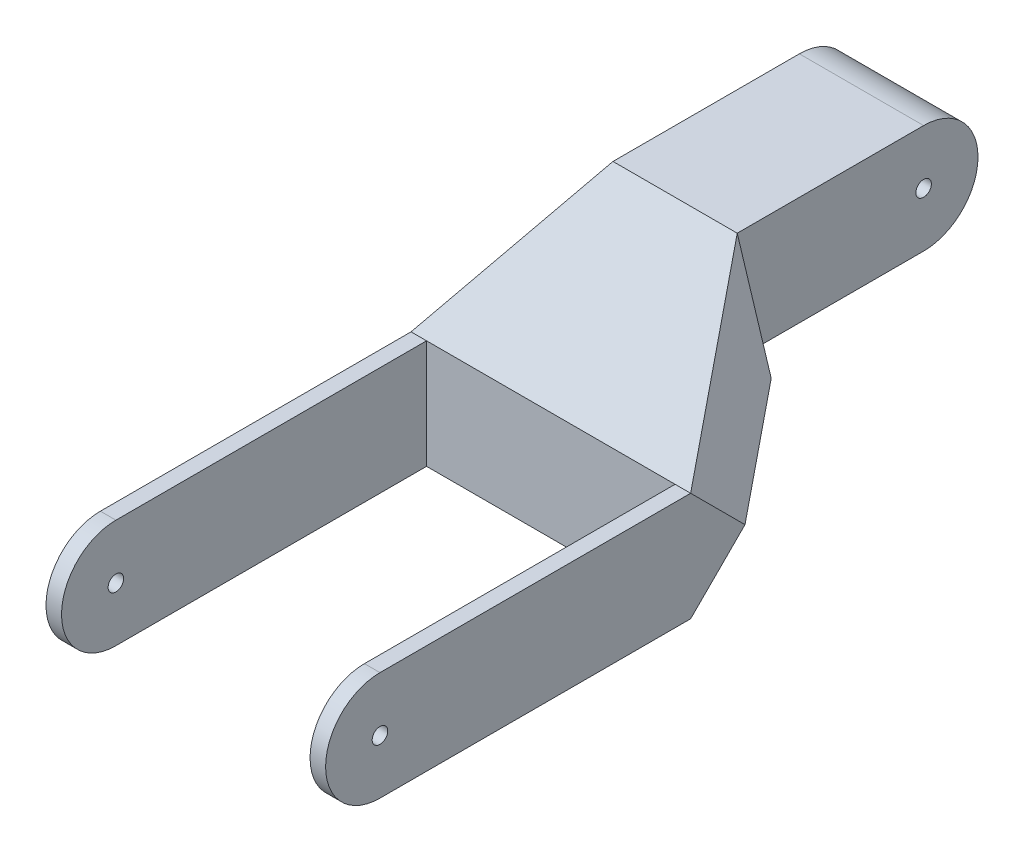
ISO-10303-21;
HEADER;
FILE_DESCRIPTION(('STEP AP214'),'2;1');
FILE_NAME('part.step','',(''),(''),'','','');
FILE_SCHEMA(('AUTOMOTIVE_DESIGN { 1 0 10303 214 1 1 1 1 }'));
ENDSEC;
DATA;
#1=APPLICATION_CONTEXT('core data for automotive mechanical design processes');
#2=APPLICATION_PROTOCOL_DEFINITION('international standard','automotive_design',2000,#1);
#3=PRODUCT_CONTEXT('',#1,'mechanical');
#4=PRODUCT('Part','Part','',(#3));
#5=PRODUCT_RELATED_PRODUCT_CATEGORY('part','',(#4));
#6=PRODUCT_DEFINITION_FORMATION('','',#4);
#7=PRODUCT_DEFINITION_CONTEXT('part definition',#1,'design');
#8=PRODUCT_DEFINITION('design','',#6,#7);
#9=PRODUCT_DEFINITION_SHAPE('','',#8);
#10=(LENGTH_UNIT() NAMED_UNIT(*) SI_UNIT(.MILLI.,.METRE.));
#11=(NAMED_UNIT(*) PLANE_ANGLE_UNIT() SI_UNIT($,.RADIAN.));
#12=(NAMED_UNIT(*) SI_UNIT($,.STERADIAN.) SOLID_ANGLE_UNIT());
#13=UNCERTAINTY_MEASURE_WITH_UNIT(LENGTH_MEASURE(1.E-05),#10,'distance_accuracy_value','');
#14=(GEOMETRIC_REPRESENTATION_CONTEXT(3) GLOBAL_UNCERTAINTY_ASSIGNED_CONTEXT((#13)) GLOBAL_UNIT_ASSIGNED_CONTEXT((#10,
#11,#12)) REPRESENTATION_CONTEXT('',''));
#15=CARTESIAN_POINT('',(0.,0.,0.));
#16=DIRECTION('',(0.,0.,1.));
#17=DIRECTION('',(1.,0.,0.));
#18=AXIS2_PLACEMENT_3D('',#15,#16,#17);
#19=CARTESIAN_POINT('',(39.1299269829849,-0.910096672164672,13.9645244649111));
#20=DIRECTION('',(0.,1.,0.));
#21=DIRECTION('',(0.,0.,1.));
#22=AXIS2_PLACEMENT_3D('',#19,#20,#21);
#23=PLANE('',#22);
#24=DIRECTION('',(0.,0.,1.));
#25=VECTOR('',#24,1.);
#26=CARTESIAN_POINT('',(0.5,-0.910096672164672,16.9645244649111));
#27=LINE('',#26,#25);
#28=CARTESIAN_POINT('',(0.5,-0.910096672164672,3.96452446491115));
#29=VERTEX_POINT('',#28);
#30=CARTESIAN_POINT('',(0.5,-0.910096672164672,13.9645244649111));
#31=VERTEX_POINT('',#30);
#32=EDGE_CURVE('E282',#29,#31,#27,.T.);
#33=ORIENTED_EDGE('',*,*,#32,.F.);
#34=DIRECTION('',(-1.,0.,0.));
#35=VECTOR('',#34,1.);
#36=CARTESIAN_POINT('',(39.1299269829849,-0.910096672164672,3.96452446491115));
#37=LINE('',#36,#35);
#38=CARTESIAN_POINT('',(0.,-0.910096672164672,3.96452446491115));
#39=VERTEX_POINT('',#38);
#40=EDGE_CURVE('E326',#29,#39,#37,.T.);
#41=ORIENTED_EDGE('',*,*,#40,.T.);
#42=DIRECTION('',(0.,0.,1.));
#43=VECTOR('',#42,1.);
#44=CARTESIAN_POINT('',(0.,-0.910096672164672,13.9645244649111));
#45=LINE('',#44,#43);
#46=CARTESIAN_POINT('',(0.,-0.910096672164672,13.9645244649111));
#47=VERTEX_POINT('',#46);
#48=EDGE_CURVE('E315',#39,#47,#45,.T.);
#49=ORIENTED_EDGE('',*,*,#48,.T.);
#50=DIRECTION('',(-1.,0.,0.));
#51=VECTOR('',#50,1.);
#52=CARTESIAN_POINT('',(39.1299269829849,-0.910096672164672,13.9645244649111));
#53=LINE('',#52,#51);
#54=EDGE_CURVE('E319',#31,#47,#53,.T.);
#55=ORIENTED_EDGE('',*,*,#54,.F.);
#56=EDGE_LOOP('',(#33,#41,#49,#55));
#57=FACE_BOUND('',#56,.T.);
#58=ADVANCED_FACE('F43',(#57),#23,.T.);
#59=CARTESIAN_POINT('',(9.,-4.41009680965972,-6.03547553508886));
#60=DIRECTION('',(0.,1.,0.));
#61=DIRECTION('',(0.,0.,1.));
#62=AXIS2_PLACEMENT_3D('',#59,#60,#61);
#63=PLANE('',#62);
#64=DIRECTION('',(1.,0.,0.));
#65=VECTOR('',#64,1.);
#66=CARTESIAN_POINT('',(0.,-4.41009680965972,3.96452446491114));
#67=LINE('',#66,#65);
#68=CARTESIAN_POINT('',(0.,-4.41009680965972,3.96452446491114));
#69=VERTEX_POINT('',#68);
#70=CARTESIAN_POINT('',(0.5,-4.41009680965973,3.96452446491115));
#71=VERTEX_POINT('',#70);
#72=EDGE_CURVE('E212',#69,#71,#67,.T.);
#73=ORIENTED_EDGE('',*,*,#72,.T.);
#74=DIRECTION('',(0.,0.,1.));
#75=VECTOR('',#74,1.);
#76=CARTESIAN_POINT('',(0.5,-4.41009680965972,-6.03547553508886));
#77=LINE('',#76,#75);
#78=CARTESIAN_POINT('',(0.5,-4.41009680965972,13.9645244649111));
#79=VERTEX_POINT('',#78);
#80=EDGE_CURVE('E303',#71,#79,#77,.T.);
#81=ORIENTED_EDGE('',*,*,#80,.T.);
#82=DIRECTION('',(-1.,0.,0.));
#83=VECTOR('',#82,1.);
#84=CARTESIAN_POINT('',(9.,-4.41009680965972,13.9645244649111));
#85=LINE('',#84,#83);
#86=CARTESIAN_POINT('',(0.,-4.41009680965972,13.9645244649111));
#87=VERTEX_POINT('',#86);
#88=EDGE_CURVE('E227',#79,#87,#85,.T.);
#89=ORIENTED_EDGE('',*,*,#88,.T.);
#90=DIRECTION('',(0.,0.,-1.));
#91=VECTOR('',#90,1.);
#92=CARTESIAN_POINT('',(0.,-4.41009680965972,-6.03547553508886));
#93=LINE('',#92,#91);
#94=EDGE_CURVE('E211',#87,#69,#93,.T.);
#95=ORIENTED_EDGE('',*,*,#94,.T.);
#96=EDGE_LOOP('',(#73,#81,#89,#95));
#97=FACE_BOUND('',#96,.T.);
#98=ADVANCED_FACE('F353',(#97),#63,.F.);
#99=CARTESIAN_POINT('',(0.,-2.6600967409122,13.9645244649111));
#100=DIRECTION('',(1.,0.,0.));
#101=DIRECTION('',(0.,0.,-1.));
#102=AXIS2_PLACEMENT_3D('',#99,#100,#101);
#103=CYLINDRICAL_SURFACE('',#102,1.75000006874753);
#104=CARTESIAN_POINT('',(0.5,-2.6600967409122,13.9645244649111));
#105=DIRECTION('',(-1.,0.,0.));
#106=DIRECTION('',(0.,0.,1.));
#107=AXIS2_PLACEMENT_3D('',#104,#105,#106);
#108=CIRCLE('',#107,1.75000006874753);
#109=EDGE_CURVE('E238',#31,#79,#108,.F.);
#110=ORIENTED_EDGE('',*,*,#109,.F.);
#111=ORIENTED_EDGE('',*,*,#54,.T.);
#112=CARTESIAN_POINT('',(0.,-2.6600967409122,13.9645244649111));
#113=DIRECTION('',(1.,0.,0.));
#114=DIRECTION('',(0.,0.,-1.));
#115=AXIS2_PLACEMENT_3D('',#112,#113,#114);
#116=CIRCLE('',#115,1.75000006874753);
#117=EDGE_CURVE('E308',#47,#87,#116,.T.);
#118=ORIENTED_EDGE('',*,*,#117,.T.);
#119=ORIENTED_EDGE('',*,*,#88,.F.);
#120=EDGE_LOOP('',(#110,#111,#118,#119));
#121=FACE_BOUND('',#120,.T.);
#122=ADVANCED_FACE('F347',(#121),#103,.T.);
#123=CARTESIAN_POINT('',(39.1299269829849,3.08990332783533,-0.0354755350888535));
#124=DIRECTION('',(0.,1.,0.));
#125=DIRECTION('',(0.,0.,1.));
#126=AXIS2_PLACEMENT_3D('',#123,#124,#125);
#127=PLANE('',#126);
#128=DIRECTION('',(0.,0.,-1.));
#129=VECTOR('',#128,1.);
#130=CARTESIAN_POINT('',(2.5,3.08990332783533,-0.0354755350888535));
#131=LINE('',#130,#129);
#132=CARTESIAN_POINT('',(2.5,3.08990332783533,-0.0354755350888535));
#133=VERTEX_POINT('',#132);
#134=CARTESIAN_POINT('',(2.5,3.08990332783533,-6.03547553508885));
#135=VERTEX_POINT('',#134);
#136=EDGE_CURVE('E69',#133,#135,#131,.T.);
#137=ORIENTED_EDGE('',*,*,#136,.F.);
#138=DIRECTION('',(-1.,0.,0.));
#139=VECTOR('',#138,1.);
#140=CARTESIAN_POINT('',(39.1299269829849,3.08990332783533,-0.0354755350888535));
#141=LINE('',#140,#139);
#142=CARTESIAN_POINT('',(6.5,3.08990332783533,-0.035475535088854));
#143=VERTEX_POINT('',#142);
#144=EDGE_CURVE('E163',#143,#133,#141,.T.);
#145=ORIENTED_EDGE('',*,*,#144,.F.);
#146=DIRECTION('',(0.,0.,1.));
#147=VECTOR('',#146,1.);
#148=CARTESIAN_POINT('',(6.5,3.08990332783533,-0.0354755350888535));
#149=LINE('',#148,#147);
#150=CARTESIAN_POINT('',(6.5,3.08990332783533,-6.03547553508885));
#151=VERTEX_POINT('',#150);
#152=EDGE_CURVE('E179',#151,#143,#149,.T.);
#153=ORIENTED_EDGE('',*,*,#152,.F.);
#154=DIRECTION('',(-1.,0.,0.));
#155=VECTOR('',#154,1.);
#156=CARTESIAN_POINT('',(39.1299269829849,3.08990332783533,-6.03547553508885));
#157=LINE('',#156,#155);
#158=EDGE_CURVE('E194',#151,#135,#157,.T.);
#159=ORIENTED_EDGE('',*,*,#158,.T.);
#160=EDGE_LOOP('',(#137,#145,#153,#159));
#161=FACE_BOUND('',#160,.T.);
#162=ADVANCED_FACE('F191',(#161),#127,.T.);
#163=CARTESIAN_POINT('',(39.1299269829849,-0.910096672164672,3.96452446491115));
#164=DIRECTION('',(0.,0.707106781186548,0.707106781186548));
#165=DIRECTION('',(0.,-0.707106781186548,0.707106781186548));
#166=AXIS2_PLACEMENT_3D('',#163,#164,#165);
#167=PLANE('',#166);
#168=DIRECTION('',(0.404226041727222,-0.646761666763555,0.646761666763555));
#169=VECTOR('',#168,1.);
#170=CARTESIAN_POINT('',(6.5,3.08990332783533,-0.035475535088854));
#171=LINE('',#170,#169);
#172=CARTESIAN_POINT('',(9.,-0.910096672164672,3.96452446491115));
#173=VERTEX_POINT('',#172);
#174=EDGE_CURVE('E148',#143,#173,#171,.T.);
#175=ORIENTED_EDGE('',*,*,#174,.F.);
#176=ORIENTED_EDGE('',*,*,#144,.T.);
#177=DIRECTION('',(0.404226041727222,0.646761666763555,-0.646761666763555));
#178=VECTOR('',#177,1.);
#179=CARTESIAN_POINT('',(2.5,3.08990332783533,-0.035475535088854));
#180=LINE('',#179,#178);
#181=EDGE_CURVE('E264',#39,#133,#180,.T.);
#182=ORIENTED_EDGE('',*,*,#181,.F.);
#183=ORIENTED_EDGE('',*,*,#40,.F.);
#184=DIRECTION('',(-1.,0.,0.));
#185=VECTOR('',#184,1.);
#186=CARTESIAN_POINT('',(8.5,-0.910096672164672,3.96452446491115));
#187=LINE('',#186,#185);
#188=CARTESIAN_POINT('',(8.5,-0.910096672164672,3.96452446491115));
#189=VERTEX_POINT('',#188);
#190=EDGE_CURVE('E289',#189,#29,#187,.T.);
#191=ORIENTED_EDGE('',*,*,#190,.F.);
#192=EDGE_CURVE('E166',#173,#189,#37,.T.);
#193=ORIENTED_EDGE('',*,*,#192,.F.);
#194=EDGE_LOOP('',(#175,#176,#182,#183,#191,#193));
#195=FACE_BOUND('',#194,.T.);
#196=ADVANCED_FACE('F160',(#195),#167,.T.);
#197=DIRECTION('',(0.,0.,-1.));
#198=VECTOR('',#197,1.);
#199=CARTESIAN_POINT('',(8.5,-0.910096672164672,16.9645244649111));
#200=LINE('',#199,#198);
#201=CARTESIAN_POINT('',(8.5,-0.910096672164672,13.9645244649111));
#202=VERTEX_POINT('',#201);
#203=EDGE_CURVE('E285',#202,#189,#200,.T.);
#204=ORIENTED_EDGE('',*,*,#203,.F.);
#205=CARTESIAN_POINT('',(9.,-0.910096672164672,13.9645244649111));
#206=VERTEX_POINT('',#205);
#207=EDGE_CURVE('E323',#206,#202,#53,.T.);
#208=ORIENTED_EDGE('',*,*,#207,.F.);
#209=DIRECTION('',(0.,0.,1.));
#210=VECTOR('',#209,1.);
#211=CARTESIAN_POINT('',(9.,-0.910096672164672,13.9645244649111));
#212=LINE('',#211,#210);
#213=EDGE_CURVE('E312',#173,#206,#212,.T.);
#214=ORIENTED_EDGE('',*,*,#213,.F.);
#215=ORIENTED_EDGE('',*,*,#192,.T.);
#216=EDGE_LOOP('',(#204,#208,#214,#215));
#217=FACE_BOUND('',#216,.T.);
#218=ADVANCED_FACE('F375',(#217),#23,.T.);
#219=CARTESIAN_POINT('',(9.,-4.41009680965972,13.9645244649111));
#220=VERTEX_POINT('',#219);
#221=CARTESIAN_POINT('',(8.5,-4.41009680965972,13.9645244649111));
#222=VERTEX_POINT('',#221);
#223=EDGE_CURVE('E231',#220,#222,#85,.T.);
#224=ORIENTED_EDGE('',*,*,#223,.T.);
#225=DIRECTION('',(0.,0.,-1.));
#226=VECTOR('',#225,1.);
#227=CARTESIAN_POINT('',(8.5,-4.41009680965972,-6.03547553508886));
#228=LINE('',#227,#226);
#229=CARTESIAN_POINT('',(8.5,-4.41009680965973,3.96452446491115));
#230=VERTEX_POINT('',#229);
#231=EDGE_CURVE('E297',#222,#230,#228,.T.);
#232=ORIENTED_EDGE('',*,*,#231,.T.);
#233=CARTESIAN_POINT('',(9.,-4.41009680965972,3.96452446491114));
#234=VERTEX_POINT('',#233);
#235=EDGE_CURVE('E217',#230,#234,#67,.T.);
#236=ORIENTED_EDGE('',*,*,#235,.T.);
#237=DIRECTION('',(0.,0.,-1.));
#238=VECTOR('',#237,1.);
#239=CARTESIAN_POINT('',(9.,-4.41009680965972,-6.03547553508886));
#240=LINE('',#239,#238);
#241=EDGE_CURVE('E223',#220,#234,#240,.T.);
#242=ORIENTED_EDGE('',*,*,#241,.F.);
#243=EDGE_LOOP('',(#224,#232,#236,#242));
#244=FACE_BOUND('',#243,.T.);
#245=ADVANCED_FACE('F45',(#244),#63,.F.);
#246=CARTESIAN_POINT('',(9.,0.,0.));
#247=DIRECTION('',(-1.,0.,0.));
#248=DIRECTION('',(0.,0.,1.));
#249=AXIS2_PLACEMENT_3D('',#246,#247,#248);
#250=PLANE('',#249);
#251=CARTESIAN_POINT('',(9.,-2.6600967409122,13.9645244649111));
#252=DIRECTION('',(-1.,0.,0.));
#253=DIRECTION('',(0.,0.,1.));
#254=AXIS2_PLACEMENT_3D('',#251,#252,#253);
#255=CIRCLE('',#254,0.25);
#256=CARTESIAN_POINT('',(9.,-2.6600967409122,14.2145244649111));
#257=VERTEX_POINT('',#256);
#258=EDGE_CURVE('E422',#257,#257,#255,.T.);
#259=ORIENTED_EDGE('',*,*,#258,.T.);
#260=EDGE_LOOP('',(#259));
#261=FACE_BOUND('',#260,.T.);
#262=DIRECTION('',(0.,0.707106781186548,-0.707106781186548));
#263=VECTOR('',#262,1.);
#264=CARTESIAN_POINT('',(9.,-0.222786172374289,-0.222786172374289));
#265=LINE('',#264,#263);
#266=CARTESIAN_POINT('',(9.,-2.6600967409122,2.21452439616362));
#267=VERTEX_POINT('',#266);
#268=EDGE_CURVE('E193',#234,#267,#265,.T.);
#269=ORIENTED_EDGE('',*,*,#268,.T.);
#270=DIRECTION('',(0.,0.707106781186548,0.707106781186547));
#271=VECTOR('',#270,1.);
#272=CARTESIAN_POINT('',(9.,-7.2740577028436,-2.39943656576778));
#273=LINE('',#272,#271);
#274=EDGE_CURVE('E155',#267,#173,#273,.T.);
#275=ORIENTED_EDGE('',*,*,#274,.T.);
#276=ORIENTED_EDGE('',*,*,#213,.T.);
#277=CARTESIAN_POINT('',(9.,-2.6600967409122,13.9645244649111));
#278=DIRECTION('',(1.,0.,0.));
#279=DIRECTION('',(0.,0.,-1.));
#280=AXIS2_PLACEMENT_3D('',#277,#278,#279);
#281=CIRCLE('',#280,1.75000006874753);
#282=EDGE_CURVE('E307',#206,#220,#281,.T.);
#283=ORIENTED_EDGE('',*,*,#282,.T.);
#284=ORIENTED_EDGE('',*,*,#241,.T.);
#285=EDGE_LOOP('',(#269,#275,#276,#283,#284));
#286=FACE_BOUND('',#285,.T.);
#287=ADVANCED_FACE('F367',(#261,#286),#250,.F.);
#288=CARTESIAN_POINT('',(0.,0.,0.));
#289=DIRECTION('',(-1.,0.,0.));
#290=DIRECTION('',(0.,0.,1.));
#291=AXIS2_PLACEMENT_3D('',#288,#289,#290);
#292=PLANE('',#291);
#293=CARTESIAN_POINT('',(0.,-2.6600967409122,13.9645244649111));
#294=DIRECTION('',(-1.,0.,0.));
#295=DIRECTION('',(0.,0.,1.));
#296=AXIS2_PLACEMENT_3D('',#293,#294,#295);
#297=CIRCLE('',#296,0.25);
#298=CARTESIAN_POINT('',(0.,-2.6600967409122,14.2145244649111));
#299=VERTEX_POINT('',#298);
#300=EDGE_CURVE('E419',#299,#299,#297,.T.);
#301=ORIENTED_EDGE('',*,*,#300,.F.);
#302=EDGE_LOOP('',(#301));
#303=FACE_BOUND('',#302,.T.);
#304=DIRECTION('',(0.,0.707106781186548,0.707106781186547));
#305=VECTOR('',#304,1.);
#306=CARTESIAN_POINT('',(0.,-7.2740577028436,-2.39943656576778));
#307=LINE('',#306,#305);
#308=CARTESIAN_POINT('',(0.,-2.6600967409122,2.21452439616362));
#309=VERTEX_POINT('',#308);
#310=EDGE_CURVE('E267',#309,#39,#307,.T.);
#311=ORIENTED_EDGE('',*,*,#310,.F.);
#312=DIRECTION('',(0.,0.707106781186548,-0.707106781186548));
#313=VECTOR('',#312,1.);
#314=CARTESIAN_POINT('',(0.,-0.222786172374289,-0.222786172374289));
#315=LINE('',#314,#313);
#316=EDGE_CURVE('E199',#69,#309,#315,.T.);
#317=ORIENTED_EDGE('',*,*,#316,.F.);
#318=ORIENTED_EDGE('',*,*,#94,.F.);
#319=ORIENTED_EDGE('',*,*,#117,.F.);
#320=ORIENTED_EDGE('',*,*,#48,.F.);
#321=EDGE_LOOP('',(#311,#317,#318,#319,#320));
#322=FACE_BOUND('',#321,.T.);
#323=ADVANCED_FACE('F341',(#303,#322),#292,.T.);
#324=CARTESIAN_POINT('',(0.,-0.410096811285625,-1.87954272890271E-08));
#325=DIRECTION('',(0.,-0.999999999999999,-4.5831683572727E-08));
#326=DIRECTION('',(0.,4.5831683572727E-08,-0.999999999999999));
#327=AXIS2_PLACEMENT_3D('',#324,#325,#326);
#328=PLANE('',#327);
#329=DIRECTION('',(0.,-4.5831683572727E-08,0.999999999999999));
#330=VECTOR('',#329,1.);
#331=CARTESIAN_POINT('',(2.5,-0.410096811285625,-1.87954272890271E-08));
#332=LINE('',#331,#330);
#333=CARTESIAN_POINT('',(2.5,-0.410096672164672,-6.03547553508885));
#334=VERTEX_POINT('',#333);
#335=CARTESIAN_POINT('',(2.5,-0.410096809659724,-0.0354755350888535));
#336=VERTEX_POINT('',#335);
#337=EDGE_CURVE('E189',#334,#336,#332,.T.);
#338=ORIENTED_EDGE('',*,*,#337,.F.);
#339=DIRECTION('',(1.,0.,0.));
#340=VECTOR('',#339,1.);
#341=CARTESIAN_POINT('',(0.,-0.410096672164672,-6.03547553508885));
#342=LINE('',#341,#340);
#343=CARTESIAN_POINT('',(6.5,-0.410096672164672,-6.03547553508885));
#344=VERTEX_POINT('',#343);
#345=EDGE_CURVE('E207',#334,#344,#342,.T.);
#346=ORIENTED_EDGE('',*,*,#345,.T.);
#347=DIRECTION('',(0.,4.5831683572727E-08,-0.999999999999999));
#348=VECTOR('',#347,1.);
#349=CARTESIAN_POINT('',(6.5,-0.410096811285625,-1.87954272890271E-08));
#350=LINE('',#349,#348);
#351=CARTESIAN_POINT('',(6.5,-0.410096809659724,-0.0354755350888535));
#352=VERTEX_POINT('',#351);
#353=EDGE_CURVE('E178',#352,#344,#350,.T.);
#354=ORIENTED_EDGE('',*,*,#353,.F.);
#355=DIRECTION('',(1.,0.,0.));
#356=VECTOR('',#355,1.);
#357=CARTESIAN_POINT('',(0.,-0.410096809659723,-0.0354755350888553));
#358=LINE('',#357,#356);
#359=EDGE_CURVE('E222',#336,#352,#358,.T.);
#360=ORIENTED_EDGE('',*,*,#359,.F.);
#361=EDGE_LOOP('',(#338,#346,#354,#360));
#362=FACE_BOUND('',#361,.T.);
#363=ADVANCED_FACE('F403',(#362),#328,.T.);
#364=CARTESIAN_POINT('',(0.,-0.222786172374289,-0.222786172374289));
#365=DIRECTION('',(0.,-0.707106781186547,-0.707106781186547));
#366=DIRECTION('',(0.,0.707106781186548,-0.707106781186548));
#367=AXIS2_PLACEMENT_3D('',#364,#365,#366);
#368=PLANE('',#367);
#369=DIRECTION('',(-0.404226041727222,0.646761666763555,-0.646761666763555));
#370=VECTOR('',#369,1.);
#371=CARTESIAN_POINT('',(6.25500100991482,1.73190164322409,-2.17747398797267));
#372=LINE('',#371,#370);
#373=CARTESIAN_POINT('',(7.5937500429672,-0.410096809659723,-0.0354755350888544));
#374=VERTEX_POINT('',#373);
#375=EDGE_CURVE('E61',#267,#374,#372,.T.);
#376=ORIENTED_EDGE('',*,*,#375,.F.);
#377=ORIENTED_EDGE('',*,*,#268,.F.);
#378=ORIENTED_EDGE('',*,*,#235,.F.);
#379=EDGE_CURVE('E216',#71,#230,#67,.T.);
#380=ORIENTED_EDGE('',*,*,#379,.F.);
#381=ORIENTED_EDGE('',*,*,#72,.F.);
#382=ORIENTED_EDGE('',*,*,#316,.T.);
#383=DIRECTION('',(-0.404226041727222,-0.646761666763555,0.646761666763555));
#384=VECTOR('',#383,1.);
#385=CARTESIAN_POINT('',(1.27441075479106,-0.621039533246496,0.175467188497919));
#386=LINE('',#385,#384);
#387=CARTESIAN_POINT('',(1.4062499570328,-0.410096809659724,-0.0354755350888533));
#388=VERTEX_POINT('',#387);
#389=EDGE_CURVE('E270',#388,#309,#386,.T.);
#390=ORIENTED_EDGE('',*,*,#389,.F.);
#391=EDGE_CURVE('E218',#388,#336,#358,.T.);
#392=ORIENTED_EDGE('',*,*,#391,.T.);
#393=ORIENTED_EDGE('',*,*,#359,.T.);
#394=EDGE_CURVE('E174',#352,#374,#358,.T.);
#395=ORIENTED_EDGE('',*,*,#394,.T.);
#396=EDGE_LOOP('',(#376,#377,#378,#380,#381,#382,#390,#392,#393,#395));
#397=FACE_BOUND('',#396,.T.);
#398=ADVANCED_FACE('F356',(#397),#368,.T.);
#399=CARTESIAN_POINT('',(8.5,-2.6600967409122,13.9645244649111));
#400=DIRECTION('',(1.,0.,0.));
#401=DIRECTION('',(0.,0.,-1.));
#402=AXIS2_PLACEMENT_3D('',#399,#400,#401);
#403=CIRCLE('',#402,1.75000006874753);
#404=EDGE_CURVE('E235',#222,#202,#403,.F.);
#405=ORIENTED_EDGE('',*,*,#404,.F.);
#406=ORIENTED_EDGE('',*,*,#223,.F.);
#407=ORIENTED_EDGE('',*,*,#282,.F.);
#408=ORIENTED_EDGE('',*,*,#207,.T.);
#409=EDGE_LOOP('',(#405,#406,#407,#408));
#410=FACE_BOUND('',#409,.T.);
#411=ADVANCED_FACE('F372',(#410),#103,.T.);
#412=CARTESIAN_POINT('',(0.,1.33990332783533,-6.03547553508885));
#413=DIRECTION('',(1.,0.,0.));
#414=DIRECTION('',(0.,0.,-1.));
#415=AXIS2_PLACEMENT_3D('',#412,#413,#414);
#416=CYLINDRICAL_SURFACE('',#415,1.75);
#417=ORIENTED_EDGE('',*,*,#345,.F.);
#418=CARTESIAN_POINT('',(2.5,1.33990332783533,-6.03547553508885));
#419=DIRECTION('',(1.,0.,0.));
#420=DIRECTION('',(0.,0.,-1.));
#421=AXIS2_PLACEMENT_3D('',#418,#419,#420);
#422=CIRCLE('',#421,1.75);
#423=EDGE_CURVE('E53',#135,#334,#422,.F.);
#424=ORIENTED_EDGE('',*,*,#423,.F.);
#425=ORIENTED_EDGE('',*,*,#158,.F.);
#426=CARTESIAN_POINT('',(6.5,1.33990332783533,-6.03547553508885));
#427=DIRECTION('',(-1.,0.,0.));
#428=DIRECTION('',(0.,0.,1.));
#429=AXIS2_PLACEMENT_3D('',#426,#427,#428);
#430=CIRCLE('',#429,1.75);
#431=EDGE_CURVE('E184',#344,#151,#430,.F.);
#432=ORIENTED_EDGE('',*,*,#431,.F.);
#433=EDGE_LOOP('',(#417,#424,#425,#432));
#434=FACE_BOUND('',#433,.T.);
#435=ADVANCED_FACE('F397',(#434),#416,.T.);
#436=CARTESIAN_POINT('',(0.5,-9.91009667216467,16.9645244649111));
#437=DIRECTION('',(-1.,0.,0.));
#438=DIRECTION('',(0.,0.,1.));
#439=AXIS2_PLACEMENT_3D('',#436,#437,#438);
#440=PLANE('',#439);
#441=CARTESIAN_POINT('',(0.5,-2.6600967409122,13.9645244649111));
#442=DIRECTION('',(-1.,0.,0.));
#443=DIRECTION('',(0.,0.,1.));
#444=AXIS2_PLACEMENT_3D('',#441,#442,#443);
#445=CIRCLE('',#444,0.25);
#446=CARTESIAN_POINT('',(0.5,-2.6600967409122,14.2145244649111));
#447=VERTEX_POINT('',#446);
#448=EDGE_CURVE('E251',#447,#447,#445,.T.);
#449=ORIENTED_EDGE('',*,*,#448,.T.);
#450=EDGE_LOOP('',(#449));
#451=FACE_BOUND('',#450,.T.);
#452=DIRECTION('',(0.,1.,0.));
#453=VECTOR('',#452,1.);
#454=CARTESIAN_POINT('',(0.5,-9.91009667216467,3.96452446491115));
#455=LINE('',#454,#453);
#456=EDGE_CURVE('E294',#71,#29,#455,.T.);
#457=ORIENTED_EDGE('',*,*,#456,.T.);
#458=ORIENTED_EDGE('',*,*,#32,.T.);
#459=ORIENTED_EDGE('',*,*,#109,.T.);
#460=ORIENTED_EDGE('',*,*,#80,.F.);
#461=EDGE_LOOP('',(#457,#458,#459,#460));
#462=FACE_BOUND('',#461,.T.);
#463=ADVANCED_FACE('F350',(#451,#462),#440,.F.);
#464=CARTESIAN_POINT('',(8.5,-9.91009667216467,16.9645244649111));
#465=DIRECTION('',(1.,0.,0.));
#466=DIRECTION('',(0.,0.,-1.));
#467=AXIS2_PLACEMENT_3D('',#464,#465,#466);
#468=PLANE('',#467);
#469=CARTESIAN_POINT('',(8.5,-2.6600967409122,13.9645244649111));
#470=DIRECTION('',(1.,0.,0.));
#471=DIRECTION('',(0.,0.,-1.));
#472=AXIS2_PLACEMENT_3D('',#469,#470,#471);
#473=CIRCLE('',#472,0.25);
#474=CARTESIAN_POINT('',(8.5,-2.6600967409122,13.7145244649111));
#475=VERTEX_POINT('',#474);
#476=EDGE_CURVE('E47',#475,#475,#473,.T.);
#477=ORIENTED_EDGE('',*,*,#476,.T.);
#478=EDGE_LOOP('',(#477));
#479=FACE_BOUND('',#478,.T.);
#480=ORIENTED_EDGE('',*,*,#404,.T.);
#481=ORIENTED_EDGE('',*,*,#203,.T.);
#482=DIRECTION('',(0.,1.,0.));
#483=VECTOR('',#482,1.);
#484=CARTESIAN_POINT('',(8.5,-9.91009667216467,3.96452446491115));
#485=LINE('',#484,#483);
#486=EDGE_CURVE('E293',#230,#189,#485,.T.);
#487=ORIENTED_EDGE('',*,*,#486,.F.);
#488=ORIENTED_EDGE('',*,*,#231,.F.);
#489=EDGE_LOOP('',(#480,#481,#487,#488));
#490=FACE_BOUND('',#489,.T.);
#491=ADVANCED_FACE('F374',(#479,#490),#468,.F.);
#492=CARTESIAN_POINT('',(8.5,-9.91009667216467,3.96452446491115));
#493=DIRECTION('',(0.,0.,-1.));
#494=DIRECTION('',(-1.,0.,0.));
#495=AXIS2_PLACEMENT_3D('',#492,#493,#494);
#496=PLANE('',#495);
#497=ORIENTED_EDGE('',*,*,#379,.T.);
#498=ORIENTED_EDGE('',*,*,#486,.T.);
#499=ORIENTED_EDGE('',*,*,#190,.T.);
#500=ORIENTED_EDGE('',*,*,#456,.F.);
#501=EDGE_LOOP('',(#497,#498,#499,#500));
#502=FACE_BOUND('',#501,.T.);
#503=ADVANCED_FACE('F459',(#502),#496,.F.);
#504=CARTESIAN_POINT('',(6.5,-5.91009667216467,-0.0354755350888535));
#505=DIRECTION('',(0.,0.,1.));
#506=DIRECTION('',(1.,0.,0.));
#507=AXIS2_PLACEMENT_3D('',#504,#505,#506);
#508=PLANE('',#507);
#509=DIRECTION('',(0.,1.,0.));
#510=VECTOR('',#509,1.);
#511=CARTESIAN_POINT('',(6.5,-5.91009667216467,-0.0354755350888535));
#512=LINE('',#511,#510);
#513=EDGE_CURVE('E171',#352,#143,#512,.T.);
#514=ORIENTED_EDGE('',*,*,#513,.T.);
#515=DIRECTION('',(0.298274993135947,-0.95447997803503,0.));
#516=VECTOR('',#515,1.);
#517=CARTESIAN_POINT('',(9.06227758007117,-5.10938492839243,-0.0354755350888535));
#518=LINE('',#517,#516);
#519=EDGE_CURVE('E145',#143,#374,#518,.T.);
#520=ORIENTED_EDGE('',*,*,#519,.T.);
#521=ORIENTED_EDGE('',*,*,#394,.F.);
#522=EDGE_LOOP('',(#514,#520,#521));
#523=FACE_BOUND('',#522,.T.);
#524=ADVANCED_FACE('F173',(#523),#508,.F.);
#525=CARTESIAN_POINT('',(6.5,-5.91009667216467,-0.0354755350888535));
#526=DIRECTION('',(-1.,0.,0.));
#527=DIRECTION('',(0.,0.,1.));
#528=AXIS2_PLACEMENT_3D('',#525,#526,#527);
#529=PLANE('',#528);
#530=CARTESIAN_POINT('',(6.5,1.33990332783533,-6.03547553508885));
#531=DIRECTION('',(1.,0.,0.));
#532=DIRECTION('',(0.,0.,-1.));
#533=AXIS2_PLACEMENT_3D('',#530,#531,#532);
#534=CIRCLE('',#533,0.25);
#535=CARTESIAN_POINT('',(6.5,1.33990332783533,-6.28547553508885));
#536=VERTEX_POINT('',#535);
#537=EDGE_CURVE('E246',#536,#536,#534,.T.);
#538=ORIENTED_EDGE('',*,*,#537,.F.);
#539=EDGE_LOOP('',(#538));
#540=FACE_BOUND('',#539,.T.);
#541=ORIENTED_EDGE('',*,*,#353,.T.);
#542=ORIENTED_EDGE('',*,*,#431,.T.);
#543=ORIENTED_EDGE('',*,*,#152,.T.);
#544=ORIENTED_EDGE('',*,*,#513,.F.);
#545=EDGE_LOOP('',(#541,#542,#543,#544));
#546=FACE_BOUND('',#545,.T.);
#547=ADVANCED_FACE('F182',(#540,#546),#529,.F.);
#548=CARTESIAN_POINT('',(2.5,-5.91009667216467,-0.0354755350888535));
#549=DIRECTION('',(1.,0.,0.));
#550=DIRECTION('',(0.,0.,-1.));
#551=AXIS2_PLACEMENT_3D('',#548,#549,#550);
#552=PLANE('',#551);
#553=CARTESIAN_POINT('',(2.5,1.33990332783533,-6.03547553508885));
#554=DIRECTION('',(1.,0.,0.));
#555=DIRECTION('',(0.,0.,-1.));
#556=AXIS2_PLACEMENT_3D('',#553,#554,#555);
#557=CIRCLE('',#556,0.25);
#558=CARTESIAN_POINT('',(2.5,1.33990332783533,-6.28547553508885));
#559=VERTEX_POINT('',#558);
#560=EDGE_CURVE('E168',#559,#559,#557,.T.);
#561=ORIENTED_EDGE('',*,*,#560,.T.);
#562=EDGE_LOOP('',(#561));
#563=FACE_BOUND('',#562,.T.);
#564=DIRECTION('',(0.,1.,0.));
#565=VECTOR('',#564,1.);
#566=CARTESIAN_POINT('',(2.5,-5.91009667216467,-0.0354755350888535));
#567=LINE('',#566,#565);
#568=EDGE_CURVE('E275',#336,#133,#567,.T.);
#569=ORIENTED_EDGE('',*,*,#568,.T.);
#570=ORIENTED_EDGE('',*,*,#136,.T.);
#571=ORIENTED_EDGE('',*,*,#423,.T.);
#572=ORIENTED_EDGE('',*,*,#337,.T.);
#573=EDGE_LOOP('',(#569,#570,#571,#572));
#574=FACE_BOUND('',#573,.T.);
#575=ADVANCED_FACE('F451',(#563,#574),#552,.F.);
#576=CARTESIAN_POINT('',(2.5,-5.91009667216467,-0.0354755350888535));
#577=DIRECTION('',(0.,0.,1.));
#578=DIRECTION('',(1.,0.,0.));
#579=AXIS2_PLACEMENT_3D('',#576,#577,#578);
#580=PLANE('',#579);
#581=ORIENTED_EDGE('',*,*,#391,.F.);
#582=DIRECTION('',(0.298274993135947,0.95447997803503,0.));
#583=VECTOR('',#582,1.);
#584=CARTESIAN_POINT('',(-0.0622775800711742,-5.10938492839243,-0.0354755350888531));
#585=LINE('',#584,#583);
#586=EDGE_CURVE('E11',#388,#133,#585,.T.);
#587=ORIENTED_EDGE('',*,*,#586,.T.);
#588=ORIENTED_EDGE('',*,*,#568,.F.);
#589=EDGE_LOOP('',(#581,#587,#588));
#590=FACE_BOUND('',#589,.T.);
#591=ADVANCED_FACE('F449',(#590),#580,.F.);
#592=CARTESIAN_POINT('',(2.5,-3.2740577028436,-6.39943656576778));
#593=DIRECTION('',(0.914659120760047,-0.285830975237515,0.285830975237515));
#594=DIRECTION('',(0.298274993135947,0.,-0.95447997803503));
#595=AXIS2_PLACEMENT_3D('',#592,#593,#594);
#596=PLANE('',#595);
#597=ORIENTED_EDGE('',*,*,#389,.T.);
#598=ORIENTED_EDGE('',*,*,#310,.T.);
#599=ORIENTED_EDGE('',*,*,#181,.T.);
#600=ORIENTED_EDGE('',*,*,#586,.F.);
#601=EDGE_LOOP('',(#597,#598,#599,#600));
#602=FACE_BOUND('',#601,.T.);
#603=ADVANCED_FACE('F446',(#602),#596,.F.);
#604=CARTESIAN_POINT('',(6.5,-3.2740577028436,-6.39943656576778));
#605=DIRECTION('',(-0.914659120760047,-0.285830975237515,0.285830975237515));
#606=DIRECTION('',(0.298274993135947,0.,0.95447997803503));
#607=AXIS2_PLACEMENT_3D('',#604,#605,#606);
#608=PLANE('',#607);
#609=ORIENTED_EDGE('',*,*,#375,.T.);
#610=ORIENTED_EDGE('',*,*,#519,.F.);
#611=ORIENTED_EDGE('',*,*,#174,.T.);
#612=ORIENTED_EDGE('',*,*,#274,.F.);
#613=EDGE_LOOP('',(#609,#610,#611,#612));
#614=FACE_BOUND('',#613,.T.);
#615=ADVANCED_FACE('F147',(#614),#608,.F.);
#616=CARTESIAN_POINT('',(0.,1.33990332783533,-6.03547553508885));
#617=DIRECTION('',(1.,0.,0.));
#618=DIRECTION('',(0.,0.,-1.));
#619=AXIS2_PLACEMENT_3D('',#616,#617,#618);
#620=CYLINDRICAL_SURFACE('',#619,0.25);
#621=ORIENTED_EDGE('',*,*,#537,.T.);
#622=EDGE_LOOP('',(#621));
#623=FACE_BOUND('',#622,.T.);
#624=ORIENTED_EDGE('',*,*,#560,.F.);
#625=EDGE_LOOP('',(#624));
#626=FACE_BOUND('',#625,.T.);
#627=ADVANCED_FACE('F435',(#623,#626),#620,.F.);
#628=CARTESIAN_POINT('',(9.,-2.6600967409122,13.9645244649111));
#629=DIRECTION('',(-1.,0.,0.));
#630=DIRECTION('',(0.,0.,1.));
#631=AXIS2_PLACEMENT_3D('',#628,#629,#630);
#632=CYLINDRICAL_SURFACE('',#631,0.25);
#633=ORIENTED_EDGE('',*,*,#258,.F.);
#634=EDGE_LOOP('',(#633));
#635=FACE_BOUND('',#634,.T.);
#636=ORIENTED_EDGE('',*,*,#476,.F.);
#637=EDGE_LOOP('',(#636));
#638=FACE_BOUND('',#637,.T.);
#639=ADVANCED_FACE('F432',(#635,#638),#632,.F.);
#640=ORIENTED_EDGE('',*,*,#300,.T.);
#641=EDGE_LOOP('',(#640));
#642=FACE_BOUND('',#641,.T.);
#643=ORIENTED_EDGE('',*,*,#448,.F.);
#644=EDGE_LOOP('',(#643));
#645=FACE_BOUND('',#644,.T.);
#646=ADVANCED_FACE('F434',(#642,#645),#632,.F.);
#647=CLOSED_SHELL('',(#58,#98,#122,#162,#196,#218,#245,#287,#323,#363,#398,#411,#435,#463,#491,
#503,#524,#547,#575,#591,#603,#615,#627,#639,#646));
#648=MANIFOLD_SOLID_BREP('B2',#647);
#649=ADVANCED_BREP_SHAPE_REPRESENTATION('',(#18,#648),#14);
#650=SHAPE_DEFINITION_REPRESENTATION(#9,#649);
ENDSEC;
END-ISO-10303-21;
